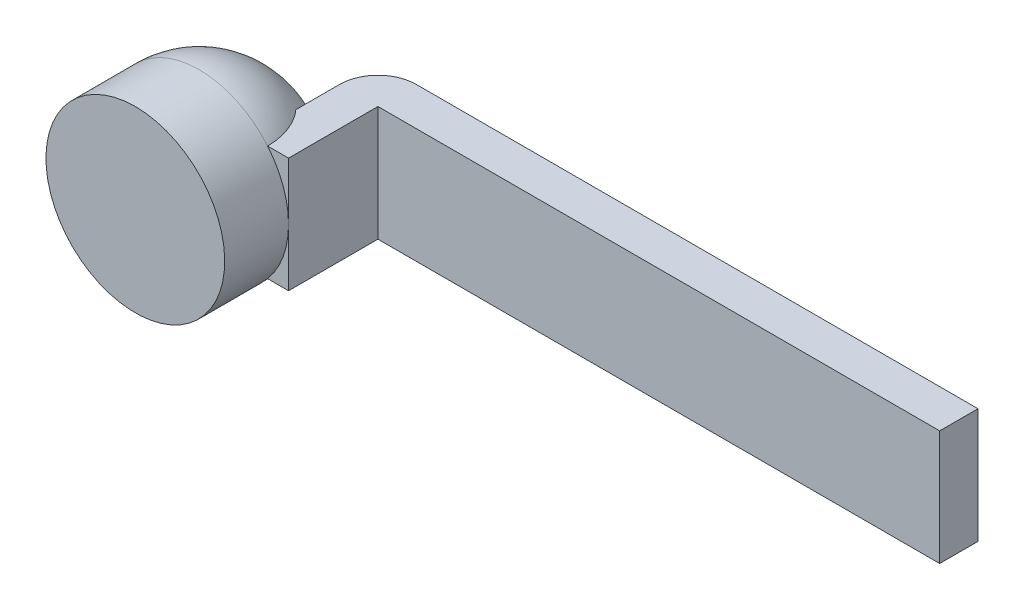
ISO-10303-21;
HEADER;
FILE_DESCRIPTION(('STEP AP214'),'2;1');
FILE_NAME('part.step','',(''),(''),'','','');
FILE_SCHEMA(('AUTOMOTIVE_DESIGN { 1 0 10303 214 1 1 1 1 }'));
ENDSEC;
DATA;
#1=APPLICATION_CONTEXT('core data for automotive mechanical design processes');
#2=APPLICATION_PROTOCOL_DEFINITION('international standard','automotive_design',2000,#1);
#3=PRODUCT_CONTEXT('',#1,'mechanical');
#4=PRODUCT('Part','Part','',(#3));
#5=PRODUCT_RELATED_PRODUCT_CATEGORY('part','',(#4));
#6=PRODUCT_DEFINITION_FORMATION('','',#4);
#7=PRODUCT_DEFINITION_CONTEXT('part definition',#1,'design');
#8=PRODUCT_DEFINITION('design','',#6,#7);
#9=PRODUCT_DEFINITION_SHAPE('','',#8);
#10=(LENGTH_UNIT() NAMED_UNIT(*) SI_UNIT(.MILLI.,.METRE.));
#11=(NAMED_UNIT(*) PLANE_ANGLE_UNIT() SI_UNIT($,.RADIAN.));
#12=(NAMED_UNIT(*) SI_UNIT($,.STERADIAN.) SOLID_ANGLE_UNIT());
#13=UNCERTAINTY_MEASURE_WITH_UNIT(LENGTH_MEASURE(1.E-05),#10,'distance_accuracy_value','');
#14=(GEOMETRIC_REPRESENTATION_CONTEXT(3) GLOBAL_UNCERTAINTY_ASSIGNED_CONTEXT((#13)) GLOBAL_UNIT_ASSIGNED_CONTEXT((#10,
#11,#12)) REPRESENTATION_CONTEXT('',''));
#15=CARTESIAN_POINT('',(0.,0.,0.));
#16=DIRECTION('',(0.,0.,1.));
#17=DIRECTION('',(1.,0.,0.));
#18=AXIS2_PLACEMENT_3D('',#15,#16,#17);
#19=CARTESIAN_POINT('',(2.75,0.45,0.));
#20=DIRECTION('',(0.,0.,1.));
#21=DIRECTION('',(0.,-1.,0.));
#22=AXIS2_PLACEMENT_3D('',#19,#20,#21);
#23=PLANE('',#22);
#24=DIRECTION('',(0.,-1.,0.));
#25=VECTOR('',#24,1.);
#26=CARTESIAN_POINT('',(3.05,0.45,0.));
#27=LINE('',#26,#25);
#28=CARTESIAN_POINT('',(3.05,0.45,0.));
#29=VERTEX_POINT('',#28);
#30=CARTESIAN_POINT('',(3.05,-0.45,0.));
#31=VERTEX_POINT('',#30);
#32=EDGE_CURVE('E30',#29,#31,#27,.T.);
#33=ORIENTED_EDGE('',*,*,#32,.F.);
#34=DIRECTION('',(-1.,0.,0.));
#35=VECTOR('',#34,1.);
#36=CARTESIAN_POINT('',(2.75,0.45,0.));
#37=LINE('',#36,#35);
#38=CARTESIAN_POINT('',(7.45,0.45,0.));
#39=VERTEX_POINT('',#38);
#40=EDGE_CURVE('E256',#39,#29,#37,.T.);
#41=ORIENTED_EDGE('',*,*,#40,.F.);
#42=DIRECTION('',(0.,1.,0.));
#43=VECTOR('',#42,1.);
#44=CARTESIAN_POINT('',(7.45,0.45,0.));
#45=LINE('',#44,#43);
#46=CARTESIAN_POINT('',(7.45,-0.45,0.));
#47=VERTEX_POINT('',#46);
#48=EDGE_CURVE('E147',#47,#39,#45,.T.);
#49=ORIENTED_EDGE('',*,*,#48,.F.);
#50=DIRECTION('',(1.,0.,0.));
#51=VECTOR('',#50,1.);
#52=CARTESIAN_POINT('',(2.75,-0.45,0.));
#53=LINE('',#52,#51);
#54=EDGE_CURVE('E11',#31,#47,#53,.T.);
#55=ORIENTED_EDGE('',*,*,#54,.F.);
#56=EDGE_LOOP('',(#33,#41,#49,#55));
#57=FACE_BOUND('',#56,.T.);
#58=ADVANCED_FACE('F17',(#57),#23,.F.);
#59=CARTESIAN_POINT('',(2.35,-0.45,0.3));
#60=DIRECTION('',(0.,-1.,0.));
#61=DIRECTION('',(0.,0.,-1.));
#62=AXIS2_PLACEMENT_3D('',#59,#60,#61);
#63=PLANE('',#62);
#64=DIRECTION('',(-1.,0.,0.));
#65=VECTOR('',#64,1.);
#66=CARTESIAN_POINT('',(2.35,-0.45,1.));
#67=LINE('',#66,#65);
#68=CARTESIAN_POINT('',(3.05,-0.45,1.));
#69=VERTEX_POINT('',#68);
#70=CARTESIAN_POINT('',(2.886190264738,-0.45,1.));
#71=VERTEX_POINT('',#70);
#72=EDGE_CURVE('E188',#69,#71,#67,.T.);
#73=ORIENTED_EDGE('',*,*,#72,.T.);
#74=CARTESIAN_POINT('',(2.886190264738,-0.45,1.));
#75=CARTESIAN_POINT('',(2.886190264738,-0.45,0.96956175032));
#76=CARTESIAN_POINT('',(2.883617447581,-0.45,0.939561658824));
#77=CARTESIAN_POINT('',(2.873542216758,-0.45,0.880401000341));
#78=CARTESIAN_POINT('',(2.866039803092,-0.45,0.851240433354));
#79=CARTESIAN_POINT('',(2.845889341445,-0.45,0.793795615748));
#80=CARTESIAN_POINT('',(2.833531359082,-0.45,0.766338282487));
#81=CARTESIAN_POINT('',(2.804441572459,-0.45,0.71384753947));
#82=CARTESIAN_POINT('',(2.787709768199,-0.45,0.688814129713));
#83=CARTESIAN_POINT('',(2.765678927182,-0.45,0.661275416852));
#84=CARTESIAN_POINT('',(2.762612822962,-0.45,0.657547149148));
#85=CARTESIAN_POINT('',(2.756381085496,-0.45,0.650174743507));
#86=CARTESIAN_POINT('',(2.753215452249,-0.45,0.646530605569));
#87=CARTESIAN_POINT('',(2.75,-0.45,0.642928578573));
#88=(BOUNDED_CURVE() B_SPLINE_CURVE(3,(#74,#75,#76,#77,#78,#79,#80,#81,#82,#83,#84,#85,#86,#87),
.UNSPECIFIED.,.F.,.F.) B_SPLINE_CURVE_WITH_KNOTS((4,2,2,2,2,2,4),(0.,0.09001867041714,
0.180037340834,0.270056011251,0.360074681669,0.374354372857,0.388634064045),
.UNSPECIFIED.) CURVE() GEOMETRIC_REPRESENTATION_ITEM() RATIONAL_B_SPLINE_CURVE((1.,1.,1.,1.,1.,
1.,1.,1.,1.,1.,1.,1.,1.,1.)) REPRESENTATION_ITEM(''));
#89=CARTESIAN_POINT('',(2.75,-0.45,0.642928578573));
#90=VERTEX_POINT('',#89);
#91=EDGE_CURVE('E120',#71,#90,#88,.T.);
#92=ORIENTED_EDGE('',*,*,#91,.T.);
#93=DIRECTION('',(0.,0.,-1.));
#94=VECTOR('',#93,1.);
#95=CARTESIAN_POINT('',(2.75,-0.45,0.3));
#96=LINE('',#95,#94);
#97=CARTESIAN_POINT('',(2.75,-0.45,0.3));
#98=VERTEX_POINT('',#97);
#99=EDGE_CURVE('E231',#90,#98,#96,.T.);
#100=ORIENTED_EDGE('',*,*,#99,.T.);
#101=CARTESIAN_POINT('',(3.05,-0.45,0.3));
#102=DIRECTION('',(0.,-1.,0.));
#103=DIRECTION('',(1.,0.,0.));
#104=AXIS2_PLACEMENT_3D('',#101,#102,#103);
#105=CIRCLE('',#104,0.3);
#106=EDGE_CURVE('E277',#98,#31,#105,.T.);
#107=ORIENTED_EDGE('',*,*,#106,.T.);
#108=ORIENTED_EDGE('',*,*,#54,.T.);
#109=DIRECTION('',(0.,0.,1.));
#110=VECTOR('',#109,1.);
#111=CARTESIAN_POINT('',(7.45,-0.45,0.3));
#112=LINE('',#111,#110);
#113=CARTESIAN_POINT('',(7.45,-0.45,0.3));
#114=VERTEX_POINT('',#113);
#115=EDGE_CURVE('E133',#47,#114,#112,.T.);
#116=ORIENTED_EDGE('',*,*,#115,.T.);
#117=DIRECTION('',(-1.,0.,0.));
#118=VECTOR('',#117,1.);
#119=CARTESIAN_POINT('',(2.35,-0.45,0.3));
#120=LINE('',#119,#118);
#121=CARTESIAN_POINT('',(3.05,-0.45,0.3));
#122=VERTEX_POINT('',#121);
#123=EDGE_CURVE('E164',#114,#122,#120,.T.);
#124=ORIENTED_EDGE('',*,*,#123,.T.);
#125=DIRECTION('',(0.,0.,1.));
#126=VECTOR('',#125,1.);
#127=CARTESIAN_POINT('',(3.05,-0.45,0.3));
#128=LINE('',#127,#126);
#129=EDGE_CURVE('E216',#122,#69,#128,.T.);
#130=ORIENTED_EDGE('',*,*,#129,.T.);
#131=EDGE_LOOP('',(#73,#92,#100,#107,#108,#116,#124,#130));
#132=FACE_BOUND('',#131,.T.);
#133=ADVANCED_FACE('F238',(#132),#63,.T.);
#134=CARTESIAN_POINT('',(3.05,0.45,0.3));
#135=DIRECTION('',(0.,-1.,0.));
#136=DIRECTION('',(1.,0.,0.));
#137=AXIS2_PLACEMENT_3D('',#134,#135,#136);
#138=CYLINDRICAL_SURFACE('',#137,0.3);
#139=ORIENTED_EDGE('',*,*,#106,.F.);
#140=DIRECTION('',(0.,1.,0.));
#141=VECTOR('',#140,1.);
#142=CARTESIAN_POINT('',(2.75,0.45,0.3));
#143=LINE('',#142,#141);
#144=CARTESIAN_POINT('',(2.75,0.45,0.3));
#145=VERTEX_POINT('',#144);
#146=EDGE_CURVE('E227',#98,#145,#143,.T.);
#147=ORIENTED_EDGE('',*,*,#146,.T.);
#148=CARTESIAN_POINT('',(3.05,0.45,0.3));
#149=DIRECTION('',(0.,-1.,0.));
#150=DIRECTION('',(1.,0.,0.));
#151=AXIS2_PLACEMENT_3D('',#148,#149,#150);
#152=CIRCLE('',#151,0.3);
#153=EDGE_CURVE('E212',#145,#29,#152,.T.);
#154=ORIENTED_EDGE('',*,*,#153,.T.);
#155=ORIENTED_EDGE('',*,*,#32,.T.);
#156=EDGE_LOOP('',(#139,#147,#154,#155));
#157=FACE_BOUND('',#156,.T.);
#158=ADVANCED_FACE('F288',(#157),#138,.T.);
#159=CARTESIAN_POINT('',(2.35,0.45,0.3));
#160=DIRECTION('',(0.,-1.,0.));
#161=DIRECTION('',(0.,0.,-1.));
#162=AXIS2_PLACEMENT_3D('',#159,#160,#161);
#163=PLANE('',#162);
#164=ORIENTED_EDGE('',*,*,#153,.F.);
#165=DIRECTION('',(0.,0.,-1.));
#166=VECTOR('',#165,1.);
#167=CARTESIAN_POINT('',(2.75,0.45,0.3));
#168=LINE('',#167,#166);
#169=CARTESIAN_POINT('',(2.75,0.45,0.642928578573));
#170=VERTEX_POINT('',#169);
#171=EDGE_CURVE('E166',#170,#145,#168,.T.);
#172=ORIENTED_EDGE('',*,*,#171,.F.);
#173=CARTESIAN_POINT('',(2.886190264738,0.45,1.));
#174=CARTESIAN_POINT('',(2.886190264738,0.45,0.96956175032));
#175=CARTESIAN_POINT('',(2.883617447581,0.45,0.939561658824));
#176=CARTESIAN_POINT('',(2.873542216758,0.45,0.880401000341));
#177=CARTESIAN_POINT('',(2.866039803092,0.45,0.851240433354));
#178=CARTESIAN_POINT('',(2.845889341445,0.45,0.793795615748));
#179=CARTESIAN_POINT('',(2.833531359082,0.45,0.766338282487));
#180=CARTESIAN_POINT('',(2.804441572459,0.45,0.71384753947));
#181=CARTESIAN_POINT('',(2.787709768199,0.45,0.688814129713));
#182=CARTESIAN_POINT('',(2.765678927182,0.45,0.661275416852));
#183=CARTESIAN_POINT('',(2.762612822962,0.45,0.657547149148));
#184=CARTESIAN_POINT('',(2.756381085496,0.45,0.650174743507));
#185=CARTESIAN_POINT('',(2.753215452249,0.45,0.646530605569));
#186=CARTESIAN_POINT('',(2.75,0.45,0.642928578573));
#187=(BOUNDED_CURVE() B_SPLINE_CURVE(3,(#173,#174,#175,#176,#177,#178,#179,#180,#181,#182,#183,
#184,#185,#186),.UNSPECIFIED.,.F.,.F.) B_SPLINE_CURVE_WITH_KNOTS((4,2,2,2,2,2,4),(0.,
0.09001867041714,0.180037340834,0.270056011251,0.360074681669,0.374354372857,0.388634064045),
.UNSPECIFIED.) CURVE() GEOMETRIC_REPRESENTATION_ITEM() RATIONAL_B_SPLINE_CURVE((1.,1.,1.,1.,1.,
1.,1.,1.,1.,1.,1.,1.,1.,1.)) REPRESENTATION_ITEM(''));
#188=CARTESIAN_POINT('',(2.886190264738,0.45,1.));
#189=VERTEX_POINT('',#188);
#190=EDGE_CURVE('E126',#189,#170,#187,.T.);
#191=ORIENTED_EDGE('',*,*,#190,.F.);
#192=DIRECTION('',(-1.,0.,0.));
#193=VECTOR('',#192,1.);
#194=CARTESIAN_POINT('',(2.35,0.45,1.));
#195=LINE('',#194,#193);
#196=CARTESIAN_POINT('',(3.05,0.45,1.));
#197=VERTEX_POINT('',#196);
#198=EDGE_CURVE('E196',#197,#189,#195,.T.);
#199=ORIENTED_EDGE('',*,*,#198,.F.);
#200=DIRECTION('',(0.,0.,1.));
#201=VECTOR('',#200,1.);
#202=CARTESIAN_POINT('',(3.05,0.45,0.3));
#203=LINE('',#202,#201);
#204=CARTESIAN_POINT('',(3.05,0.45,0.3));
#205=VERTEX_POINT('',#204);
#206=EDGE_CURVE('E156',#205,#197,#203,.T.);
#207=ORIENTED_EDGE('',*,*,#206,.F.);
#208=DIRECTION('',(-1.,0.,0.));
#209=VECTOR('',#208,1.);
#210=CARTESIAN_POINT('',(2.35,0.45,0.3));
#211=LINE('',#210,#209);
#212=CARTESIAN_POINT('',(7.45,0.45,0.3));
#213=VERTEX_POINT('',#212);
#214=EDGE_CURVE('E153',#213,#205,#211,.T.);
#215=ORIENTED_EDGE('',*,*,#214,.F.);
#216=DIRECTION('',(0.,0.,1.));
#217=VECTOR('',#216,1.);
#218=CARTESIAN_POINT('',(7.45,0.45,0.3));
#219=LINE('',#218,#217);
#220=EDGE_CURVE('E142',#39,#213,#219,.T.);
#221=ORIENTED_EDGE('',*,*,#220,.F.);
#222=ORIENTED_EDGE('',*,*,#40,.T.);
#223=EDGE_LOOP('',(#164,#172,#191,#199,#207,#215,#221,#222));
#224=FACE_BOUND('',#223,.T.);
#225=ADVANCED_FACE('F154',(#224),#163,.F.);
#226=CARTESIAN_POINT('',(7.45,0.45,0.3));
#227=DIRECTION('',(-1.,0.,0.));
#228=DIRECTION('',(0.,1.,0.));
#229=AXIS2_PLACEMENT_3D('',#226,#227,#228);
#230=PLANE('',#229);
#231=ORIENTED_EDGE('',*,*,#48,.T.);
#232=ORIENTED_EDGE('',*,*,#220,.T.);
#233=DIRECTION('',(0.,1.,0.));
#234=VECTOR('',#233,1.);
#235=CARTESIAN_POINT('',(7.45,0.45,0.3));
#236=LINE('',#235,#234);
#237=EDGE_CURVE('E146',#114,#213,#236,.T.);
#238=ORIENTED_EDGE('',*,*,#237,.F.);
#239=ORIENTED_EDGE('',*,*,#115,.F.);
#240=EDGE_LOOP('',(#231,#232,#238,#239));
#241=FACE_BOUND('',#240,.T.);
#242=ADVANCED_FACE('F144',(#241),#230,.F.);
#243=CARTESIAN_POINT('',(2.89272950938478,0.,0.557908742856234));
#244=CARTESIAN_POINT('',(2.39400174051206,0.,-0.054350090457079));
#245=CARTESIAN_POINT('',(1.65,0.,0.210322682094173));
#246=CARTESIAN_POINT('',(1.65,0.,1.));
#247=(BOUNDED_CURVE() B_SPLINE_CURVE(3,(#243,#244,#245,#246),.UNSPECIFIED.,.F.,
.F.) B_SPLINE_CURVE_WITH_KNOTS((4,4),(0.,1.),
.UNSPECIFIED.) CURVE() GEOMETRIC_REPRESENTATION_ITEM() RATIONAL_B_SPLINE_CURVE((1.,
0.556777151502124,0.556777151502124,1.)) REPRESENTATION_ITEM(''));
#248=CARTESIAN_POINT('',(2.35,0.,1.));
#249=DIRECTION('',(-1.,0.,0.));
#250=AXIS1_PLACEMENT('',#248,#249);
#251=SURFACE_OF_REVOLUTION('',#247,#250);
#252=CARTESIAN_POINT('',(2.35,0.,1.));
#253=DIRECTION('',(0.,0.,-1.));
#254=DIRECTION('',(1.,0.,0.));
#255=AXIS2_PLACEMENT_3D('',#252,#253,#254);
#256=CIRCLE('',#255,0.7);
#257=CARTESIAN_POINT('',(1.65,0.,1.));
#258=VERTEX_POINT('',#257);
#259=CARTESIAN_POINT('',(2.35,0.7,1.));
#260=VERTEX_POINT('',#259);
#261=EDGE_CURVE('E99',#258,#260,#256,.T.);
#262=ORIENTED_EDGE('',*,*,#261,.T.);
#263=CARTESIAN_POINT('',(2.35,0.,1.));
#264=DIRECTION('',(0.,0.,-1.));
#265=DIRECTION('',(1.,0.,0.));
#266=AXIS2_PLACEMENT_3D('',#263,#264,#265);
#267=CIRCLE('',#266,0.7);
#268=EDGE_CURVE('E208',#260,#189,#267,.T.);
#269=ORIENTED_EDGE('',*,*,#268,.T.);
#270=ORIENTED_EDGE('',*,*,#190,.T.);
#271=CARTESIAN_POINT('',(2.75,0.,1.));
#272=DIRECTION('',(-1.,0.,0.));
#273=DIRECTION('',(0.,1.,0.));
#274=AXIS2_PLACEMENT_3D('',#271,#272,#273);
#275=CIRCLE('',#274,0.574456264654);
#276=EDGE_CURVE('E173',#170,#90,#275,.T.);
#277=ORIENTED_EDGE('',*,*,#276,.T.);
#278=ORIENTED_EDGE('',*,*,#91,.F.);
#279=CARTESIAN_POINT('',(2.35,0.,1.));
#280=DIRECTION('',(0.,0.,-1.));
#281=DIRECTION('',(1.,0.,0.));
#282=AXIS2_PLACEMENT_3D('',#279,#280,#281);
#283=CIRCLE('',#282,0.7);
#284=EDGE_CURVE('E183',#71,#258,#283,.T.);
#285=ORIENTED_EDGE('',*,*,#284,.T.);
#286=EDGE_LOOP('',(#262,#269,#270,#277,#278,#285));
#287=FACE_BOUND('',#286,.T.);
#288=ADVANCED_FACE('F19',(#287),#251,.T.);
#289=CARTESIAN_POINT('',(2.75,0.45,1.));
#290=DIRECTION('',(0.,0.,-1.));
#291=DIRECTION('',(-1.,0.,0.));
#292=AXIS2_PLACEMENT_3D('',#289,#290,#291);
#293=PLANE('',#292);
#294=CARTESIAN_POINT('',(2.35,0.,1.));
#295=DIRECTION('',(0.,0.,1.));
#296=DIRECTION('',(0.,1.,0.));
#297=AXIS2_PLACEMENT_3D('',#294,#295,#296);
#298=CIRCLE('',#297,0.7);
#299=CARTESIAN_POINT('',(3.05,0.,1.));
#300=VERTEX_POINT('',#299);
#301=EDGE_CURVE('E209',#71,#300,#298,.T.);
#302=ORIENTED_EDGE('',*,*,#301,.F.);
#303=ORIENTED_EDGE('',*,*,#72,.F.);
#304=DIRECTION('',(0.,-1.,0.));
#305=VECTOR('',#304,1.);
#306=CARTESIAN_POINT('',(3.05,0.45,1.));
#307=LINE('',#306,#305);
#308=EDGE_CURVE('E109',#300,#69,#307,.T.);
#309=ORIENTED_EDGE('',*,*,#308,.F.);
#310=EDGE_LOOP('',(#302,#303,#309));
#311=FACE_BOUND('',#310,.T.);
#312=ADVANCED_FACE('F318',(#311),#293,.F.);
#313=CARTESIAN_POINT('',(3.05,0.45,0.3));
#314=DIRECTION('',(-1.,0.,0.));
#315=DIRECTION('',(0.,1.,0.));
#316=AXIS2_PLACEMENT_3D('',#313,#314,#315);
#317=PLANE('',#316);
#318=DIRECTION('',(0.,-1.,0.));
#319=VECTOR('',#318,1.);
#320=CARTESIAN_POINT('',(3.05,0.45,0.3));
#321=LINE('',#320,#319);
#322=EDGE_CURVE('E161',#205,#122,#321,.T.);
#323=ORIENTED_EDGE('',*,*,#322,.F.);
#324=ORIENTED_EDGE('',*,*,#206,.T.);
#325=DIRECTION('',(0.,1.,0.));
#326=VECTOR('',#325,1.);
#327=CARTESIAN_POINT('',(3.05,0.45,1.));
#328=LINE('',#327,#326);
#329=EDGE_CURVE('E189',#300,#197,#328,.T.);
#330=ORIENTED_EDGE('',*,*,#329,.F.);
#331=ORIENTED_EDGE('',*,*,#308,.T.);
#332=ORIENTED_EDGE('',*,*,#129,.F.);
#333=EDGE_LOOP('',(#323,#324,#330,#331,#332));
#334=FACE_BOUND('',#333,.T.);
#335=ADVANCED_FACE('F240',(#334),#317,.F.);
#336=CARTESIAN_POINT('',(7.45,0.45,0.3));
#337=DIRECTION('',(0.,0.,-1.));
#338=DIRECTION('',(-1.,0.,0.));
#339=AXIS2_PLACEMENT_3D('',#336,#337,#338);
#340=PLANE('',#339);
#341=ORIENTED_EDGE('',*,*,#237,.T.);
#342=ORIENTED_EDGE('',*,*,#214,.T.);
#343=ORIENTED_EDGE('',*,*,#322,.T.);
#344=ORIENTED_EDGE('',*,*,#123,.F.);
#345=EDGE_LOOP('',(#341,#342,#343,#344));
#346=FACE_BOUND('',#345,.T.);
#347=ADVANCED_FACE('F163',(#346),#340,.F.);
#348=CARTESIAN_POINT('',(2.75,0.45,1.));
#349=DIRECTION('',(1.,0.,0.));
#350=DIRECTION('',(0.,1.,0.));
#351=AXIS2_PLACEMENT_3D('',#348,#349,#350);
#352=PLANE('',#351);
#353=ORIENTED_EDGE('',*,*,#146,.F.);
#354=ORIENTED_EDGE('',*,*,#99,.F.);
#355=ORIENTED_EDGE('',*,*,#276,.F.);
#356=ORIENTED_EDGE('',*,*,#171,.T.);
#357=EDGE_LOOP('',(#353,#354,#355,#356));
#358=FACE_BOUND('',#357,.T.);
#359=ADVANCED_FACE('F269',(#358),#352,.F.);
#360=CARTESIAN_POINT('',(2.75,0.45,1.));
#361=DIRECTION('',(0.,0.,-1.));
#362=DIRECTION('',(-1.,0.,0.));
#363=AXIS2_PLACEMENT_3D('',#360,#361,#362);
#364=PLANE('',#363);
#365=CARTESIAN_POINT('',(2.35,0.,1.));
#366=DIRECTION('',(0.,0.,1.));
#367=DIRECTION('',(0.,1.,0.));
#368=AXIS2_PLACEMENT_3D('',#365,#366,#367);
#369=CIRCLE('',#368,0.7);
#370=EDGE_CURVE('E201',#300,#189,#369,.T.);
#371=ORIENTED_EDGE('',*,*,#370,.F.);
#372=ORIENTED_EDGE('',*,*,#329,.T.);
#373=ORIENTED_EDGE('',*,*,#198,.T.);
#374=EDGE_LOOP('',(#371,#372,#373));
#375=FACE_BOUND('',#374,.T.);
#376=ADVANCED_FACE('F244',(#375),#364,.F.);
#377=CARTESIAN_POINT('',(2.35,0.,1.443755419131));
#378=DIRECTION('',(0.,0.,1.));
#379=DIRECTION('',(0.,1.,0.));
#380=AXIS2_PLACEMENT_3D('',#377,#378,#379);
#381=CYLINDRICAL_SURFACE('',#380,0.7);
#382=ORIENTED_EDGE('',*,*,#284,.F.);
#383=ORIENTED_EDGE('',*,*,#301,.T.);
#384=ORIENTED_EDGE('',*,*,#370,.T.);
#385=ORIENTED_EDGE('',*,*,#268,.F.);
#386=CARTESIAN_POINT('',(2.35,0.7,1.));
#387=CARTESIAN_POINT('',(2.35,0.7,1.5));
#388=(BOUNDED_CURVE() B_SPLINE_CURVE(1,(#386,#387),.UNSPECIFIED.,.F.,
.F.) B_SPLINE_CURVE_WITH_KNOTS((2,2),(-0.443755419131,0.05624458086904),
.UNSPECIFIED.) CURVE() GEOMETRIC_REPRESENTATION_ITEM() RATIONAL_B_SPLINE_CURVE((1.,1.)) REPRESENTATION_ITEM(''));
#389=CARTESIAN_POINT('',(2.35,0.7,1.5));
#390=VERTEX_POINT('',#389);
#391=EDGE_CURVE('E177',#260,#390,#388,.T.);
#392=ORIENTED_EDGE('',*,*,#391,.T.);
#393=CARTESIAN_POINT('',(2.35,0.,1.5));
#394=DIRECTION('',(0.,0.,-1.));
#395=DIRECTION('',(0.,1.,0.));
#396=AXIS2_PLACEMENT_3D('',#393,#394,#395);
#397=CIRCLE('',#396,0.7);
#398=EDGE_CURVE('E180',#390,#390,#397,.T.);
#399=ORIENTED_EDGE('',*,*,#398,.T.);
#400=ORIENTED_EDGE('',*,*,#391,.F.);
#401=ORIENTED_EDGE('',*,*,#261,.F.);
#402=EDGE_LOOP('',(#382,#383,#384,#385,#392,#399,#400,#401));
#403=FACE_BOUND('',#402,.T.);
#404=ADVANCED_FACE('F246',(#403),#381,.T.);
#405=CARTESIAN_POINT('',(2.35,0.,1.5));
#406=DIRECTION('',(0.,0.,-1.));
#407=DIRECTION('',(-1.,0.,0.));
#408=AXIS2_PLACEMENT_3D('',#405,#406,#407);
#409=PLANE('',#408);
#410=ORIENTED_EDGE('',*,*,#398,.F.);
#411=EDGE_LOOP('',(#410));
#412=FACE_BOUND('',#411,.T.);
#413=ADVANCED_FACE('F324',(#412),#409,.F.);
#414=CLOSED_SHELL('',(#58,#133,#158,#225,#242,#288,#312,#335,#347,#359,#376,#404,#413));
#415=MANIFOLD_SOLID_BREP('B1',#414);
#416=ADVANCED_BREP_SHAPE_REPRESENTATION('',(#18,#415),#14);
#417=SHAPE_DEFINITION_REPRESENTATION(#9,#416);
ENDSEC;
END-ISO-10303-21;
